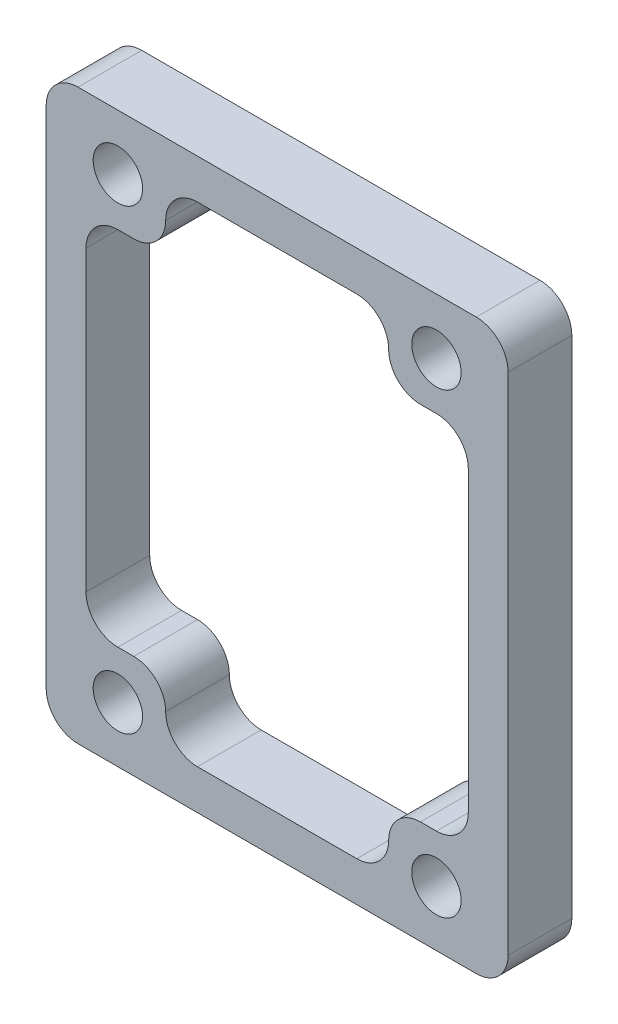
ISO-10303-21;
HEADER;
FILE_DESCRIPTION(('STEP AP214'),'2;1');
FILE_NAME('part.step','',(''),(''),'','','');
FILE_SCHEMA(('AUTOMOTIVE_DESIGN { 1 0 10303 214 1 1 1 1 }'));
ENDSEC;
DATA;
#1=APPLICATION_CONTEXT('core data for automotive mechanical design processes');
#2=APPLICATION_PROTOCOL_DEFINITION('international standard','automotive_design',2000,#1);
#3=PRODUCT_CONTEXT('',#1,'mechanical');
#4=PRODUCT('Part','Part','',(#3));
#5=PRODUCT_RELATED_PRODUCT_CATEGORY('part','',(#4));
#6=PRODUCT_DEFINITION_FORMATION('','',#4);
#7=PRODUCT_DEFINITION_CONTEXT('part definition',#1,'design');
#8=PRODUCT_DEFINITION('design','',#6,#7);
#9=PRODUCT_DEFINITION_SHAPE('','',#8);
#10=(LENGTH_UNIT() NAMED_UNIT(*) SI_UNIT(.MILLI.,.METRE.));
#11=(NAMED_UNIT(*) PLANE_ANGLE_UNIT() SI_UNIT($,.RADIAN.));
#12=(NAMED_UNIT(*) SI_UNIT($,.STERADIAN.) SOLID_ANGLE_UNIT());
#13=UNCERTAINTY_MEASURE_WITH_UNIT(LENGTH_MEASURE(1.E-05),#10,'distance_accuracy_value','');
#14=(GEOMETRIC_REPRESENTATION_CONTEXT(3) GLOBAL_UNCERTAINTY_ASSIGNED_CONTEXT((#13)) GLOBAL_UNIT_ASSIGNED_CONTEXT((#10,
#11,#12)) REPRESENTATION_CONTEXT('',''));
#15=CARTESIAN_POINT('',(0.,0.,0.));
#16=DIRECTION('',(0.,0.,1.));
#17=DIRECTION('',(1.,0.,0.));
#18=AXIS2_PLACEMENT_3D('',#15,#16,#17);
#19=CARTESIAN_POINT('',(12.,-11.35,8.));
#20=DIRECTION('',(0.,-1.,0.));
#21=DIRECTION('',(1.,0.,0.));
#22=AXIS2_PLACEMENT_3D('',#19,#20,#21);
#23=PLANE('',#22);
#24=DIRECTION('',(-1.,0.,0.));
#25=VECTOR('',#24,1.);
#26=CARTESIAN_POINT('',(12.,-11.35,-2.));
#27=LINE('',#26,#25);
#28=CARTESIAN_POINT('',(-9.,-11.35,-2.));
#29=VERTEX_POINT('',#28);
#30=CARTESIAN_POINT('',(-10.,-11.35,-2.));
#31=VERTEX_POINT('',#30);
#32=EDGE_CURVE('E456',#29,#31,#27,.T.);
#33=ORIENTED_EDGE('',*,*,#32,.T.);
#34=DIRECTION('',(0.,0.,-1.));
#35=VECTOR('',#34,1.);
#36=CARTESIAN_POINT('',(-10.,-11.35,2.));
#37=LINE('',#36,#35);
#38=CARTESIAN_POINT('',(-10.,-11.35,2.));
#39=VERTEX_POINT('',#38);
#40=EDGE_CURVE('E342',#31,#39,#37,.F.);
#41=ORIENTED_EDGE('',*,*,#40,.T.);
#42=DIRECTION('',(-1.,0.,0.));
#43=VECTOR('',#42,1.);
#44=CARTESIAN_POINT('',(0.,-11.35,2.));
#45=LINE('',#44,#43);
#46=CARTESIAN_POINT('',(-9.,-11.35,2.));
#47=VERTEX_POINT('',#46);
#48=EDGE_CURVE('E513',#47,#39,#45,.T.);
#49=ORIENTED_EDGE('',*,*,#48,.F.);
#50=DIRECTION('',(0.,0.,-1.));
#51=VECTOR('',#50,1.);
#52=CARTESIAN_POINT('',(-9.,-11.35,8.));
#53=LINE('',#52,#51);
#54=EDGE_CURVE('E339',#47,#29,#53,.T.);
#55=ORIENTED_EDGE('',*,*,#54,.T.);
#56=EDGE_LOOP('',(#33,#41,#49,#55));
#57=FACE_BOUND('',#56,.T.);
#58=ADVANCED_FACE('F39',(#57),#23,.F.);
#59=CARTESIAN_POINT('',(12.,11.35,8.));
#60=DIRECTION('',(0.,1.,0.));
#61=DIRECTION('',(-1.,0.,0.));
#62=AXIS2_PLACEMENT_3D('',#59,#60,#61);
#63=PLANE('',#62);
#64=DIRECTION('',(1.,0.,0.));
#65=VECTOR('',#64,1.);
#66=CARTESIAN_POINT('',(12.,11.35,-2.));
#67=LINE('',#66,#65);
#68=CARTESIAN_POINT('',(-10.,11.35,-2.));
#69=VERTEX_POINT('',#68);
#70=CARTESIAN_POINT('',(-9.,11.35,-2.));
#71=VERTEX_POINT('',#70);
#72=EDGE_CURVE('E445',#69,#71,#67,.T.);
#73=ORIENTED_EDGE('',*,*,#72,.T.);
#74=DIRECTION('',(0.,0.,1.));
#75=VECTOR('',#74,1.);
#76=CARTESIAN_POINT('',(-9.,11.35,8.));
#77=LINE('',#76,#75);
#78=CARTESIAN_POINT('',(-9.,11.35,2.));
#79=VERTEX_POINT('',#78);
#80=EDGE_CURVE('E332',#71,#79,#77,.T.);
#81=ORIENTED_EDGE('',*,*,#80,.T.);
#82=DIRECTION('',(1.,0.,0.));
#83=VECTOR('',#82,1.);
#84=CARTESIAN_POINT('',(0.,11.35,2.));
#85=LINE('',#84,#83);
#86=CARTESIAN_POINT('',(-10.,11.35,2.));
#87=VERTEX_POINT('',#86);
#88=EDGE_CURVE('E516',#87,#79,#85,.T.);
#89=ORIENTED_EDGE('',*,*,#88,.F.);
#90=DIRECTION('',(0.,0.,-1.));
#91=VECTOR('',#90,1.);
#92=CARTESIAN_POINT('',(-10.,11.35,-2.));
#93=LINE('',#92,#91);
#94=EDGE_CURVE('E329',#87,#69,#93,.T.);
#95=ORIENTED_EDGE('',*,*,#94,.T.);
#96=EDGE_LOOP('',(#73,#81,#89,#95));
#97=FACE_BOUND('',#96,.T.);
#98=ADVANCED_FACE('F574',(#97),#63,.F.);
#99=CARTESIAN_POINT('',(14.5,-17.85,2.));
#100=DIRECTION('',(-1.,0.,0.));
#101=DIRECTION('',(0.,0.,1.));
#102=AXIS2_PLACEMENT_3D('',#99,#100,#101);
#103=PLANE('',#102);
#104=DIRECTION('',(0.,1.,0.));
#105=VECTOR('',#104,1.);
#106=CARTESIAN_POINT('',(14.5,-17.85,2.));
#107=LINE('',#106,#105);
#108=CARTESIAN_POINT('',(14.5,-15.85,2.));
#109=VERTEX_POINT('',#108);
#110=CARTESIAN_POINT('',(14.5,15.85,2.));
#111=VERTEX_POINT('',#110);
#112=EDGE_CURVE('E247',#109,#111,#107,.T.);
#113=ORIENTED_EDGE('',*,*,#112,.F.);
#114=DIRECTION('',(0.,0.,-1.));
#115=VECTOR('',#114,1.);
#116=CARTESIAN_POINT('',(14.5,-15.85,2.));
#117=LINE('',#116,#115);
#118=CARTESIAN_POINT('',(14.5,-15.85,-2.));
#119=VERTEX_POINT('',#118);
#120=EDGE_CURVE('E231',#109,#119,#117,.T.);
#121=ORIENTED_EDGE('',*,*,#120,.T.);
#122=DIRECTION('',(0.,1.,0.));
#123=VECTOR('',#122,1.);
#124=CARTESIAN_POINT('',(14.5,-17.85,-2.));
#125=LINE('',#124,#123);
#126=CARTESIAN_POINT('',(14.5,15.85,-2.));
#127=VERTEX_POINT('',#126);
#128=EDGE_CURVE('E244',#119,#127,#125,.T.);
#129=ORIENTED_EDGE('',*,*,#128,.T.);
#130=DIRECTION('',(0.,0.,-1.));
#131=VECTOR('',#130,1.);
#132=CARTESIAN_POINT('',(14.5,15.85,2.));
#133=LINE('',#132,#131);
#134=EDGE_CURVE('E249',#127,#111,#133,.F.);
#135=ORIENTED_EDGE('',*,*,#134,.T.);
#136=EDGE_LOOP('',(#113,#121,#129,#135));
#137=FACE_BOUND('',#136,.T.);
#138=ADVANCED_FACE('F243',(#137),#103,.F.);
#139=CARTESIAN_POINT('',(-14.5,17.85,2.));
#140=DIRECTION('',(0.,-1.,0.));
#141=DIRECTION('',(0.,0.,-1.));
#142=AXIS2_PLACEMENT_3D('',#139,#140,#141);
#143=PLANE('',#142);
#144=DIRECTION('',(-1.,0.,0.));
#145=VECTOR('',#144,1.);
#146=CARTESIAN_POINT('',(-14.5,17.85,2.));
#147=LINE('',#146,#145);
#148=CARTESIAN_POINT('',(12.5,17.85,2.));
#149=VERTEX_POINT('',#148);
#150=CARTESIAN_POINT('',(-12.5,17.85,2.));
#151=VERTEX_POINT('',#150);
#152=EDGE_CURVE('E492',#149,#151,#147,.T.);
#153=ORIENTED_EDGE('',*,*,#152,.F.);
#154=DIRECTION('',(0.,0.,-1.));
#155=VECTOR('',#154,1.);
#156=CARTESIAN_POINT('',(12.5,17.85,2.));
#157=LINE('',#156,#155);
#158=CARTESIAN_POINT('',(12.5,17.85,-2.));
#159=VERTEX_POINT('',#158);
#160=EDGE_CURVE('E346',#149,#159,#157,.T.);
#161=ORIENTED_EDGE('',*,*,#160,.T.);
#162=DIRECTION('',(-1.,0.,0.));
#163=VECTOR('',#162,1.);
#164=CARTESIAN_POINT('',(-14.5,17.85,-2.));
#165=LINE('',#164,#163);
#166=CARTESIAN_POINT('',(-12.5,17.85,-2.));
#167=VERTEX_POINT('',#166);
#168=EDGE_CURVE('E254',#159,#167,#165,.T.);
#169=ORIENTED_EDGE('',*,*,#168,.T.);
#170=DIRECTION('',(0.,0.,-1.));
#171=VECTOR('',#170,1.);
#172=CARTESIAN_POINT('',(-12.5,17.85,2.));
#173=LINE('',#172,#171);
#174=EDGE_CURVE('E344',#167,#151,#173,.F.);
#175=ORIENTED_EDGE('',*,*,#174,.T.);
#176=EDGE_LOOP('',(#153,#161,#169,#175));
#177=FACE_BOUND('',#176,.T.);
#178=ADVANCED_FACE('F621',(#177),#143,.F.);
#179=CARTESIAN_POINT('',(-14.5,-17.85,2.));
#180=DIRECTION('',(1.,0.,0.));
#181=DIRECTION('',(0.,0.,-1.));
#182=AXIS2_PLACEMENT_3D('',#179,#180,#181);
#183=PLANE('',#182);
#184=DIRECTION('',(0.,-1.,0.));
#185=VECTOR('',#184,1.);
#186=CARTESIAN_POINT('',(-14.5,-17.85,-2.));
#187=LINE('',#186,#185);
#188=CARTESIAN_POINT('',(-14.5,15.85,-2.));
#189=VERTEX_POINT('',#188);
#190=CARTESIAN_POINT('',(-14.5,-15.85,-2.));
#191=VERTEX_POINT('',#190);
#192=EDGE_CURVE('E258',#189,#191,#187,.T.);
#193=ORIENTED_EDGE('',*,*,#192,.T.);
#194=DIRECTION('',(0.,0.,-1.));
#195=VECTOR('',#194,1.);
#196=CARTESIAN_POINT('',(-14.5,-15.85,2.));
#197=LINE('',#196,#195);
#198=CARTESIAN_POINT('',(-14.5,-15.85,2.));
#199=VERTEX_POINT('',#198);
#200=EDGE_CURVE('E56',#191,#199,#197,.F.);
#201=ORIENTED_EDGE('',*,*,#200,.T.);
#202=DIRECTION('',(0.,-1.,0.));
#203=VECTOR('',#202,1.);
#204=CARTESIAN_POINT('',(-14.5,-17.85,2.));
#205=LINE('',#204,#203);
#206=CARTESIAN_POINT('',(-14.5,15.85,2.));
#207=VERTEX_POINT('',#206);
#208=EDGE_CURVE('E490',#207,#199,#205,.T.);
#209=ORIENTED_EDGE('',*,*,#208,.F.);
#210=DIRECTION('',(0.,0.,-1.));
#211=VECTOR('',#210,1.);
#212=CARTESIAN_POINT('',(-14.5,15.85,2.));
#213=LINE('',#212,#211);
#214=EDGE_CURVE('E300',#207,#189,#213,.T.);
#215=ORIENTED_EDGE('',*,*,#214,.T.);
#216=EDGE_LOOP('',(#193,#201,#209,#215));
#217=FACE_BOUND('',#216,.T.);
#218=ADVANCED_FACE('F617',(#217),#183,.F.);
#219=CARTESIAN_POINT('',(-14.5,-17.85,2.));
#220=DIRECTION('',(0.,1.,0.));
#221=DIRECTION('',(0.,0.,1.));
#222=AXIS2_PLACEMENT_3D('',#219,#220,#221);
#223=PLANE('',#222);
#224=DIRECTION('',(1.,0.,0.));
#225=VECTOR('',#224,1.);
#226=CARTESIAN_POINT('',(-14.5,-17.85,-2.));
#227=LINE('',#226,#225);
#228=CARTESIAN_POINT('',(-12.5,-17.85,-2.));
#229=VERTEX_POINT('',#228);
#230=CARTESIAN_POINT('',(12.5,-17.85,-2.));
#231=VERTEX_POINT('',#230);
#232=EDGE_CURVE('E475',#229,#231,#227,.T.);
#233=ORIENTED_EDGE('',*,*,#232,.T.);
#234=DIRECTION('',(0.,0.,-1.));
#235=VECTOR('',#234,1.);
#236=CARTESIAN_POINT('',(12.5,-17.85,2.));
#237=LINE('',#236,#235);
#238=CARTESIAN_POINT('',(12.5,-17.85,2.));
#239=VERTEX_POINT('',#238);
#240=EDGE_CURVE('E232',#231,#239,#237,.F.);
#241=ORIENTED_EDGE('',*,*,#240,.T.);
#242=DIRECTION('',(1.,0.,0.));
#243=VECTOR('',#242,1.);
#244=CARTESIAN_POINT('',(-14.5,-17.85,2.));
#245=LINE('',#244,#243);
#246=CARTESIAN_POINT('',(-12.5,-17.85,2.));
#247=VERTEX_POINT('',#246);
#248=EDGE_CURVE('E265',#247,#239,#245,.T.);
#249=ORIENTED_EDGE('',*,*,#248,.F.);
#250=DIRECTION('',(0.,0.,-1.));
#251=VECTOR('',#250,1.);
#252=CARTESIAN_POINT('',(-12.5,-17.85,2.));
#253=LINE('',#252,#251);
#254=EDGE_CURVE('E237',#247,#229,#253,.T.);
#255=ORIENTED_EDGE('',*,*,#254,.T.);
#256=EDGE_LOOP('',(#233,#241,#249,#255));
#257=FACE_BOUND('',#256,.T.);
#258=ADVANCED_FACE('F612',(#257),#223,.F.);
#259=CARTESIAN_POINT('',(0.,0.,2.));
#260=DIRECTION('',(0.,0.,-1.));
#261=DIRECTION('',(-1.,0.,0.));
#262=AXIS2_PLACEMENT_3D('',#259,#260,#261);
#263=PLANE('',#262);
#264=CARTESIAN_POINT('',(9.99999999999999,-11.35,2.));
#265=VERTEX_POINT('',#264);
#266=CARTESIAN_POINT('',(8.99999999999999,-11.35,2.));
#267=VERTEX_POINT('',#266);
#268=EDGE_CURVE('E511',#265,#267,#45,.T.);
#269=ORIENTED_EDGE('',*,*,#268,.T.);
#270=CARTESIAN_POINT('',(8.99999999999999,-13.35,2.));
#271=DIRECTION('',(0.,0.,-1.));
#272=DIRECTION('',(-1.,0.,0.));
#273=AXIS2_PLACEMENT_3D('',#270,#271,#272);
#274=CIRCLE('',#273,2.);
#275=CARTESIAN_POINT('',(6.99999999999999,-13.35,2.));
#276=VERTEX_POINT('',#275);
#277=EDGE_CURVE('E294',#267,#276,#274,.F.);
#278=ORIENTED_EDGE('',*,*,#277,.T.);
#279=CARTESIAN_POINT('',(4.99999999999999,-13.35,2.));
#280=DIRECTION('',(0.,0.,-1.));
#281=DIRECTION('',(-1.,0.,0.));
#282=AXIS2_PLACEMENT_3D('',#279,#280,#281);
#283=CIRCLE('',#282,2.);
#284=CARTESIAN_POINT('',(4.99999999999999,-15.35,2.));
#285=VERTEX_POINT('',#284);
#286=EDGE_CURVE('E351',#276,#285,#283,.T.);
#287=ORIENTED_EDGE('',*,*,#286,.T.);
#288=DIRECTION('',(-1.,0.,0.));
#289=VECTOR('',#288,1.);
#290=CARTESIAN_POINT('',(0.,-15.35,2.));
#291=LINE('',#290,#289);
#292=CARTESIAN_POINT('',(-5.,-15.35,2.));
#293=VERTEX_POINT('',#292);
#294=EDGE_CURVE('E415',#285,#293,#291,.T.);
#295=ORIENTED_EDGE('',*,*,#294,.T.);
#296=CARTESIAN_POINT('',(-5.,-13.35,2.));
#297=DIRECTION('',(0.,0.,-1.));
#298=DIRECTION('',(-1.,0.,0.));
#299=AXIS2_PLACEMENT_3D('',#296,#297,#298);
#300=CIRCLE('',#299,2.);
#301=CARTESIAN_POINT('',(-7.,-13.35,2.));
#302=VERTEX_POINT('',#301);
#303=EDGE_CURVE('E12',#293,#302,#300,.T.);
#304=ORIENTED_EDGE('',*,*,#303,.T.);
#305=CARTESIAN_POINT('',(-9.,-13.35,2.));
#306=DIRECTION('',(0.,0.,-1.));
#307=DIRECTION('',(-1.,0.,0.));
#308=AXIS2_PLACEMENT_3D('',#305,#306,#307);
#309=CIRCLE('',#308,2.);
#310=EDGE_CURVE('E288',#302,#47,#309,.F.);
#311=ORIENTED_EDGE('',*,*,#310,.T.);
#312=ORIENTED_EDGE('',*,*,#48,.T.);
#313=CARTESIAN_POINT('',(-10.,-9.35,2.));
#314=DIRECTION('',(0.,0.,-1.));
#315=DIRECTION('',(-1.,0.,0.));
#316=AXIS2_PLACEMENT_3D('',#313,#314,#315);
#317=CIRCLE('',#316,2.);
#318=CARTESIAN_POINT('',(-12.,-9.35,2.));
#319=VERTEX_POINT('',#318);
#320=EDGE_CURVE('E375',#39,#319,#317,.T.);
#321=ORIENTED_EDGE('',*,*,#320,.T.);
#322=DIRECTION('',(0.,1.,0.));
#323=VECTOR('',#322,1.);
#324=CARTESIAN_POINT('',(-12.,0.,2.));
#325=LINE('',#324,#323);
#326=CARTESIAN_POINT('',(-12.,9.35,2.));
#327=VERTEX_POINT('',#326);
#328=EDGE_CURVE('E504',#319,#327,#325,.T.);
#329=ORIENTED_EDGE('',*,*,#328,.T.);
#330=CARTESIAN_POINT('',(-10.,9.35,2.));
#331=DIRECTION('',(0.,0.,-1.));
#332=DIRECTION('',(-1.,0.,0.));
#333=AXIS2_PLACEMENT_3D('',#330,#331,#332);
#334=CIRCLE('',#333,2.);
#335=EDGE_CURVE('E371',#327,#87,#334,.T.);
#336=ORIENTED_EDGE('',*,*,#335,.T.);
#337=ORIENTED_EDGE('',*,*,#88,.T.);
#338=CARTESIAN_POINT('',(-9.,13.35,2.));
#339=DIRECTION('',(0.,0.,-1.));
#340=DIRECTION('',(-1.,0.,0.));
#341=AXIS2_PLACEMENT_3D('',#338,#339,#340);
#342=CIRCLE('',#341,2.);
#343=CARTESIAN_POINT('',(-7.,13.35,2.));
#344=VERTEX_POINT('',#343);
#345=EDGE_CURVE('E290',#79,#344,#342,.F.);
#346=ORIENTED_EDGE('',*,*,#345,.T.);
#347=CARTESIAN_POINT('',(-5.,13.35,2.));
#348=DIRECTION('',(0.,0.,-1.));
#349=DIRECTION('',(-1.,0.,0.));
#350=AXIS2_PLACEMENT_3D('',#347,#348,#349);
#351=CIRCLE('',#350,2.);
#352=CARTESIAN_POINT('',(-5.,15.35,2.));
#353=VERTEX_POINT('',#352);
#354=EDGE_CURVE('E367',#344,#353,#351,.T.);
#355=ORIENTED_EDGE('',*,*,#354,.T.);
#356=DIRECTION('',(1.,0.,0.));
#357=VECTOR('',#356,1.);
#358=CARTESIAN_POINT('',(0.,15.35,2.));
#359=LINE('',#358,#357);
#360=CARTESIAN_POINT('',(5.,15.35,2.));
#361=VERTEX_POINT('',#360);
#362=EDGE_CURVE('E412',#353,#361,#359,.T.);
#363=ORIENTED_EDGE('',*,*,#362,.T.);
#364=CARTESIAN_POINT('',(5.,13.35,2.));
#365=DIRECTION('',(0.,0.,-1.));
#366=DIRECTION('',(-1.,0.,0.));
#367=AXIS2_PLACEMENT_3D('',#364,#365,#366);
#368=CIRCLE('',#367,2.);
#369=CARTESIAN_POINT('',(7.,13.35,2.));
#370=VERTEX_POINT('',#369);
#371=EDGE_CURVE('E363',#361,#370,#368,.T.);
#372=ORIENTED_EDGE('',*,*,#371,.T.);
#373=CARTESIAN_POINT('',(9.,13.35,2.));
#374=DIRECTION('',(0.,0.,-1.));
#375=DIRECTION('',(-1.,0.,0.));
#376=AXIS2_PLACEMENT_3D('',#373,#374,#375);
#377=CIRCLE('',#376,2.);
#378=CARTESIAN_POINT('',(9.,11.35,2.));
#379=VERTEX_POINT('',#378);
#380=EDGE_CURVE('E292',#370,#379,#377,.F.);
#381=ORIENTED_EDGE('',*,*,#380,.T.);
#382=CARTESIAN_POINT('',(10.,11.35,2.));
#383=VERTEX_POINT('',#382);
#384=EDGE_CURVE('E461',#379,#383,#85,.T.);
#385=ORIENTED_EDGE('',*,*,#384,.T.);
#386=CARTESIAN_POINT('',(10.,9.35,2.));
#387=DIRECTION('',(0.,0.,-1.));
#388=DIRECTION('',(-1.,0.,0.));
#389=AXIS2_PLACEMENT_3D('',#386,#387,#388);
#390=CIRCLE('',#389,2.);
#391=CARTESIAN_POINT('',(12.,9.35,2.));
#392=VERTEX_POINT('',#391);
#393=EDGE_CURVE('E359',#383,#392,#390,.T.);
#394=ORIENTED_EDGE('',*,*,#393,.T.);
#395=DIRECTION('',(0.,-1.,0.));
#396=VECTOR('',#395,1.);
#397=CARTESIAN_POINT('',(12.,0.,2.));
#398=LINE('',#397,#396);
#399=CARTESIAN_POINT('',(12.,-9.35,2.));
#400=VERTEX_POINT('',#399);
#401=EDGE_CURVE('E514',#392,#400,#398,.T.);
#402=ORIENTED_EDGE('',*,*,#401,.T.);
#403=CARTESIAN_POINT('',(9.99999999999999,-9.35,2.));
#404=DIRECTION('',(0.,0.,-1.));
#405=DIRECTION('',(-1.,0.,0.));
#406=AXIS2_PLACEMENT_3D('',#403,#404,#405);
#407=CIRCLE('',#406,2.);
#408=EDGE_CURVE('E355',#400,#265,#407,.T.);
#409=ORIENTED_EDGE('',*,*,#408,.T.);
#410=EDGE_LOOP('',(#269,#278,#287,#295,#304,#311,#312,#321,#329,#336,#337,#346,#355,#363,#372,
#381,#385,#394,#402,#409));
#411=FACE_BOUND('',#410,.T.);
#412=CARTESIAN_POINT('',(-10.,14.35,2.));
#413=DIRECTION('',(0.,0.,1.));
#414=DIRECTION('',(1.,0.,0.));
#415=AXIS2_PLACEMENT_3D('',#412,#413,#414);
#416=CIRCLE('',#415,1.55);
#417=CARTESIAN_POINT('',(-8.45,14.35,2.));
#418=VERTEX_POINT('',#417);
#419=EDGE_CURVE('E500',#418,#418,#416,.T.);
#420=ORIENTED_EDGE('',*,*,#419,.F.);
#421=EDGE_LOOP('',(#420));
#422=FACE_BOUND('',#421,.T.);
#423=CARTESIAN_POINT('',(-10.,-14.35,2.));
#424=DIRECTION('',(0.,0.,1.));
#425=DIRECTION('',(1.,0.,0.));
#426=AXIS2_PLACEMENT_3D('',#423,#424,#425);
#427=CIRCLE('',#426,1.55);
#428=CARTESIAN_POINT('',(-8.45,-14.35,2.));
#429=VERTEX_POINT('',#428);
#430=EDGE_CURVE('E503',#429,#429,#427,.T.);
#431=ORIENTED_EDGE('',*,*,#430,.F.);
#432=EDGE_LOOP('',(#431));
#433=FACE_BOUND('',#432,.T.);
#434=CARTESIAN_POINT('',(10.,-14.35,2.));
#435=DIRECTION('',(0.,0.,1.));
#436=DIRECTION('',(1.,0.,0.));
#437=AXIS2_PLACEMENT_3D('',#434,#435,#436);
#438=CIRCLE('',#437,1.55);
#439=CARTESIAN_POINT('',(11.55,-14.35,2.));
#440=VERTEX_POINT('',#439);
#441=EDGE_CURVE('E499',#440,#440,#438,.T.);
#442=ORIENTED_EDGE('',*,*,#441,.F.);
#443=EDGE_LOOP('',(#442));
#444=FACE_BOUND('',#443,.T.);
#445=CARTESIAN_POINT('',(10.,14.35,2.));
#446=DIRECTION('',(0.,0.,1.));
#447=DIRECTION('',(1.,0.,0.));
#448=AXIS2_PLACEMENT_3D('',#445,#446,#447);
#449=CIRCLE('',#448,1.55);
#450=CARTESIAN_POINT('',(11.55,14.35,2.));
#451=VERTEX_POINT('',#450);
#452=EDGE_CURVE('E482',#451,#451,#449,.T.);
#453=ORIENTED_EDGE('',*,*,#452,.F.);
#454=EDGE_LOOP('',(#453));
#455=FACE_BOUND('',#454,.T.);
#456=ORIENTED_EDGE('',*,*,#248,.T.);
#457=CARTESIAN_POINT('',(12.5,-15.85,2.));
#458=DIRECTION('',(0.,0.,-1.));
#459=DIRECTION('',(-1.,0.,0.));
#460=AXIS2_PLACEMENT_3D('',#457,#458,#459);
#461=CIRCLE('',#460,2.);
#462=EDGE_CURVE('E298',#239,#109,#461,.F.);
#463=ORIENTED_EDGE('',*,*,#462,.T.);
#464=ORIENTED_EDGE('',*,*,#112,.T.);
#465=CARTESIAN_POINT('',(12.5,15.85,2.));
#466=DIRECTION('',(0.,0.,-1.));
#467=DIRECTION('',(-1.,0.,0.));
#468=AXIS2_PLACEMENT_3D('',#465,#466,#467);
#469=CIRCLE('',#468,2.);
#470=EDGE_CURVE('E286',#111,#149,#469,.F.);
#471=ORIENTED_EDGE('',*,*,#470,.T.);
#472=ORIENTED_EDGE('',*,*,#152,.T.);
#473=CARTESIAN_POINT('',(-12.5,15.85,2.));
#474=DIRECTION('',(0.,0.,-1.));
#475=DIRECTION('',(-1.,0.,0.));
#476=AXIS2_PLACEMENT_3D('',#473,#474,#475);
#477=CIRCLE('',#476,2.);
#478=EDGE_CURVE('E63',#151,#207,#477,.F.);
#479=ORIENTED_EDGE('',*,*,#478,.T.);
#480=ORIENTED_EDGE('',*,*,#208,.T.);
#481=CARTESIAN_POINT('',(-12.5,-15.85,2.));
#482=DIRECTION('',(0.,0.,-1.));
#483=DIRECTION('',(-1.,0.,0.));
#484=AXIS2_PLACEMENT_3D('',#481,#482,#483);
#485=CIRCLE('',#484,2.);
#486=EDGE_CURVE('E296',#199,#247,#485,.F.);
#487=ORIENTED_EDGE('',*,*,#486,.T.);
#488=EDGE_LOOP('',(#456,#463,#464,#471,#472,#479,#480,#487));
#489=FACE_BOUND('',#488,.T.);
#490=ADVANCED_FACE('F540',(#411,#422,#433,#444,#455,#489),#263,.F.);
#491=CARTESIAN_POINT('',(0.,0.,-2.));
#492=DIRECTION('',(0.,0.,-1.));
#493=DIRECTION('',(-1.,0.,0.));
#494=AXIS2_PLACEMENT_3D('',#491,#492,#493);
#495=PLANE('',#494);
#496=DIRECTION('',(-1.,0.,0.));
#497=VECTOR('',#496,1.);
#498=CARTESIAN_POINT('',(6.99999999999999,-15.35,-2.));
#499=LINE('',#498,#497);
#500=CARTESIAN_POINT('',(4.99999999999999,-15.35,-2.));
#501=VERTEX_POINT('',#500);
#502=CARTESIAN_POINT('',(-5.,-15.35,-2.));
#503=VERTEX_POINT('',#502);
#504=EDGE_CURVE('E405',#501,#503,#499,.T.);
#505=ORIENTED_EDGE('',*,*,#504,.F.);
#506=CARTESIAN_POINT('',(4.99999999999999,-13.35,-2.));
#507=DIRECTION('',(0.,0.,-1.));
#508=DIRECTION('',(-1.,0.,0.));
#509=AXIS2_PLACEMENT_3D('',#506,#507,#508);
#510=CIRCLE('',#509,2.);
#511=CARTESIAN_POINT('',(6.99999999999999,-13.35,-2.));
#512=VERTEX_POINT('',#511);
#513=EDGE_CURVE('E349',#501,#512,#510,.F.);
#514=ORIENTED_EDGE('',*,*,#513,.T.);
#515=CARTESIAN_POINT('',(8.99999999999999,-13.35,-2.));
#516=DIRECTION('',(0.,0.,-1.));
#517=DIRECTION('',(-1.,0.,0.));
#518=AXIS2_PLACEMENT_3D('',#515,#516,#517);
#519=CIRCLE('',#518,2.);
#520=CARTESIAN_POINT('',(8.99999999999999,-11.35,-2.));
#521=VERTEX_POINT('',#520);
#522=EDGE_CURVE('E427',#512,#521,#519,.T.);
#523=ORIENTED_EDGE('',*,*,#522,.T.);
#524=CARTESIAN_POINT('',(9.99999999999999,-11.35,-2.));
#525=VERTEX_POINT('',#524);
#526=EDGE_CURVE('E460',#525,#521,#27,.T.);
#527=ORIENTED_EDGE('',*,*,#526,.F.);
#528=CARTESIAN_POINT('',(9.99999999999999,-9.35,-2.));
#529=DIRECTION('',(0.,0.,-1.));
#530=DIRECTION('',(-1.,0.,0.));
#531=AXIS2_PLACEMENT_3D('',#528,#529,#530);
#532=CIRCLE('',#531,2.);
#533=CARTESIAN_POINT('',(12.,-9.35,-2.));
#534=VERTEX_POINT('',#533);
#535=EDGE_CURVE('E353',#525,#534,#532,.F.);
#536=ORIENTED_EDGE('',*,*,#535,.T.);
#537=DIRECTION('',(0.,-1.,0.));
#538=VECTOR('',#537,1.);
#539=CARTESIAN_POINT('',(12.,-11.35,-2.));
#540=LINE('',#539,#538);
#541=CARTESIAN_POINT('',(12.,9.35,-2.));
#542=VERTEX_POINT('',#541);
#543=EDGE_CURVE('E449',#542,#534,#540,.T.);
#544=ORIENTED_EDGE('',*,*,#543,.F.);
#545=CARTESIAN_POINT('',(10.,9.35,-2.));
#546=DIRECTION('',(0.,0.,-1.));
#547=DIRECTION('',(-1.,0.,0.));
#548=AXIS2_PLACEMENT_3D('',#545,#546,#547);
#549=CIRCLE('',#548,2.);
#550=CARTESIAN_POINT('',(10.,11.35,-2.));
#551=VERTEX_POINT('',#550);
#552=EDGE_CURVE('E357',#542,#551,#549,.F.);
#553=ORIENTED_EDGE('',*,*,#552,.T.);
#554=CARTESIAN_POINT('',(9.,11.35,-2.));
#555=VERTEX_POINT('',#554);
#556=EDGE_CURVE('E450',#555,#551,#67,.T.);
#557=ORIENTED_EDGE('',*,*,#556,.F.);
#558=CARTESIAN_POINT('',(9.,13.35,-2.));
#559=DIRECTION('',(0.,0.,-1.));
#560=DIRECTION('',(-1.,0.,0.));
#561=AXIS2_PLACEMENT_3D('',#558,#559,#560);
#562=CIRCLE('',#561,2.);
#563=CARTESIAN_POINT('',(7.,13.35,-2.));
#564=VERTEX_POINT('',#563);
#565=EDGE_CURVE('E430',#555,#564,#562,.T.);
#566=ORIENTED_EDGE('',*,*,#565,.T.);
#567=CARTESIAN_POINT('',(5.,13.35,-2.));
#568=DIRECTION('',(0.,0.,-1.));
#569=DIRECTION('',(-1.,0.,0.));
#570=AXIS2_PLACEMENT_3D('',#567,#568,#569);
#571=CIRCLE('',#570,2.);
#572=CARTESIAN_POINT('',(5.,15.35,-2.));
#573=VERTEX_POINT('',#572);
#574=EDGE_CURVE('E361',#564,#573,#571,.F.);
#575=ORIENTED_EDGE('',*,*,#574,.T.);
#576=DIRECTION('',(1.,0.,0.));
#577=VECTOR('',#576,1.);
#578=CARTESIAN_POINT('',(7.,15.35,-2.));
#579=LINE('',#578,#577);
#580=CARTESIAN_POINT('',(-5.,15.35,-2.));
#581=VERTEX_POINT('',#580);
#582=EDGE_CURVE('E381',#581,#573,#579,.T.);
#583=ORIENTED_EDGE('',*,*,#582,.F.);
#584=CARTESIAN_POINT('',(-5.,13.35,-2.));
#585=DIRECTION('',(0.,0.,-1.));
#586=DIRECTION('',(-1.,0.,0.));
#587=AXIS2_PLACEMENT_3D('',#584,#585,#586);
#588=CIRCLE('',#587,2.);
#589=CARTESIAN_POINT('',(-7.,13.35,-2.));
#590=VERTEX_POINT('',#589);
#591=EDGE_CURVE('E365',#581,#590,#588,.F.);
#592=ORIENTED_EDGE('',*,*,#591,.T.);
#593=CARTESIAN_POINT('',(-9.,13.35,-2.));
#594=DIRECTION('',(0.,0.,-1.));
#595=DIRECTION('',(-1.,0.,0.));
#596=AXIS2_PLACEMENT_3D('',#593,#594,#595);
#597=CIRCLE('',#596,2.);
#598=EDGE_CURVE('E433',#590,#71,#597,.T.);
#599=ORIENTED_EDGE('',*,*,#598,.T.);
#600=ORIENTED_EDGE('',*,*,#72,.F.);
#601=CARTESIAN_POINT('',(-10.,9.35,-2.));
#602=DIRECTION('',(0.,0.,-1.));
#603=DIRECTION('',(-1.,0.,0.));
#604=AXIS2_PLACEMENT_3D('',#601,#602,#603);
#605=CIRCLE('',#604,2.);
#606=CARTESIAN_POINT('',(-12.,9.35,-2.));
#607=VERTEX_POINT('',#606);
#608=EDGE_CURVE('E369',#69,#607,#605,.F.);
#609=ORIENTED_EDGE('',*,*,#608,.T.);
#610=DIRECTION('',(0.,1.,0.));
#611=VECTOR('',#610,1.);
#612=CARTESIAN_POINT('',(-12.,-11.35,-2.));
#613=LINE('',#612,#611);
#614=CARTESIAN_POINT('',(-12.,-9.35,-2.));
#615=VERTEX_POINT('',#614);
#616=EDGE_CURVE('E451',#615,#607,#613,.T.);
#617=ORIENTED_EDGE('',*,*,#616,.F.);
#618=CARTESIAN_POINT('',(-10.,-9.35,-2.));
#619=DIRECTION('',(0.,0.,-1.));
#620=DIRECTION('',(-1.,0.,0.));
#621=AXIS2_PLACEMENT_3D('',#618,#619,#620);
#622=CIRCLE('',#621,2.);
#623=EDGE_CURVE('E373',#615,#31,#622,.F.);
#624=ORIENTED_EDGE('',*,*,#623,.T.);
#625=ORIENTED_EDGE('',*,*,#32,.F.);
#626=CARTESIAN_POINT('',(-9.,-13.35,-2.));
#627=DIRECTION('',(0.,0.,-1.));
#628=DIRECTION('',(-1.,0.,0.));
#629=AXIS2_PLACEMENT_3D('',#626,#627,#628);
#630=CIRCLE('',#629,2.);
#631=CARTESIAN_POINT('',(-7.,-13.35,-2.));
#632=VERTEX_POINT('',#631);
#633=EDGE_CURVE('E395',#29,#632,#630,.T.);
#634=ORIENTED_EDGE('',*,*,#633,.T.);
#635=CARTESIAN_POINT('',(-5.,-13.35,-2.));
#636=DIRECTION('',(0.,0.,-1.));
#637=DIRECTION('',(-1.,0.,0.));
#638=AXIS2_PLACEMENT_3D('',#635,#636,#637);
#639=CIRCLE('',#638,2.);
#640=EDGE_CURVE('E48',#632,#503,#639,.F.);
#641=ORIENTED_EDGE('',*,*,#640,.T.);
#642=EDGE_LOOP('',(#505,#514,#523,#527,#536,#544,#553,#557,#566,#575,#583,#592,#599,#600,#609,
#617,#624,#625,#634,#641));
#643=FACE_BOUND('',#642,.T.);
#644=CARTESIAN_POINT('',(-10.,14.35,-2.));
#645=DIRECTION('',(0.,0.,-1.));
#646=DIRECTION('',(-1.,0.,0.));
#647=AXIS2_PLACEMENT_3D('',#644,#645,#646);
#648=CIRCLE('',#647,1.55);
#649=CARTESIAN_POINT('',(-11.55,14.35,-2.));
#650=VERTEX_POINT('',#649);
#651=EDGE_CURVE('E255',#650,#650,#648,.T.);
#652=ORIENTED_EDGE('',*,*,#651,.F.);
#653=EDGE_LOOP('',(#652));
#654=FACE_BOUND('',#653,.T.);
#655=CARTESIAN_POINT('',(-10.,-14.35,-2.));
#656=DIRECTION('',(0.,0.,-1.));
#657=DIRECTION('',(-1.,0.,0.));
#658=AXIS2_PLACEMENT_3D('',#655,#656,#657);
#659=CIRCLE('',#658,1.55);
#660=CARTESIAN_POINT('',(-11.55,-14.35,-2.));
#661=VERTEX_POINT('',#660);
#662=EDGE_CURVE('E261',#661,#661,#659,.T.);
#663=ORIENTED_EDGE('',*,*,#662,.F.);
#664=EDGE_LOOP('',(#663));
#665=FACE_BOUND('',#664,.T.);
#666=CARTESIAN_POINT('',(10.,-14.35,-2.));
#667=DIRECTION('',(0.,0.,-1.));
#668=DIRECTION('',(-1.,0.,0.));
#669=AXIS2_PLACEMENT_3D('',#666,#667,#668);
#670=CIRCLE('',#669,1.55);
#671=CARTESIAN_POINT('',(8.45,-14.35,-2.));
#672=VERTEX_POINT('',#671);
#673=EDGE_CURVE('E481',#672,#672,#670,.T.);
#674=ORIENTED_EDGE('',*,*,#673,.F.);
#675=EDGE_LOOP('',(#674));
#676=FACE_BOUND('',#675,.T.);
#677=CARTESIAN_POINT('',(10.,14.35,-2.));
#678=DIRECTION('',(0.,0.,-1.));
#679=DIRECTION('',(-1.,0.,0.));
#680=AXIS2_PLACEMENT_3D('',#677,#678,#679);
#681=CIRCLE('',#680,1.55);
#682=CARTESIAN_POINT('',(8.45,14.35,-2.));
#683=VERTEX_POINT('',#682);
#684=EDGE_CURVE('E477',#683,#683,#681,.T.);
#685=ORIENTED_EDGE('',*,*,#684,.F.);
#686=EDGE_LOOP('',(#685));
#687=FACE_BOUND('',#686,.T.);
#688=ORIENTED_EDGE('',*,*,#128,.F.);
#689=CARTESIAN_POINT('',(12.5,-15.85,-2.));
#690=DIRECTION('',(0.,0.,-1.));
#691=DIRECTION('',(-1.,0.,0.));
#692=AXIS2_PLACEMENT_3D('',#689,#690,#691);
#693=CIRCLE('',#692,2.);
#694=EDGE_CURVE('E227',#119,#231,#693,.T.);
#695=ORIENTED_EDGE('',*,*,#694,.T.);
#696=ORIENTED_EDGE('',*,*,#232,.F.);
#697=CARTESIAN_POINT('',(-12.5,-15.85,-2.));
#698=DIRECTION('',(0.,0.,-1.));
#699=DIRECTION('',(-1.,0.,0.));
#700=AXIS2_PLACEMENT_3D('',#697,#698,#699);
#701=CIRCLE('',#700,2.);
#702=EDGE_CURVE('E238',#229,#191,#701,.T.);
#703=ORIENTED_EDGE('',*,*,#702,.T.);
#704=ORIENTED_EDGE('',*,*,#192,.F.);
#705=CARTESIAN_POINT('',(-12.5,15.85,-2.));
#706=DIRECTION('',(0.,0.,-1.));
#707=DIRECTION('',(-1.,0.,0.));
#708=AXIS2_PLACEMENT_3D('',#705,#706,#707);
#709=CIRCLE('',#708,2.);
#710=EDGE_CURVE('E248',#189,#167,#709,.T.);
#711=ORIENTED_EDGE('',*,*,#710,.T.);
#712=ORIENTED_EDGE('',*,*,#168,.F.);
#713=CARTESIAN_POINT('',(12.5,15.85,-2.));
#714=DIRECTION('',(0.,0.,-1.));
#715=DIRECTION('',(-1.,0.,0.));
#716=AXIS2_PLACEMENT_3D('',#713,#714,#715);
#717=CIRCLE('',#716,2.);
#718=EDGE_CURVE('E253',#159,#127,#717,.T.);
#719=ORIENTED_EDGE('',*,*,#718,.T.);
#720=EDGE_LOOP('',(#688,#695,#696,#703,#704,#711,#712,#719));
#721=FACE_BOUND('',#720,.T.);
#722=ADVANCED_FACE('F251',(#643,#654,#665,#676,#687,#721),#495,.T.);
#723=CARTESIAN_POINT('',(10.,14.35,-22.));
#724=DIRECTION('',(0.,0.,1.));
#725=DIRECTION('',(1.,0.,0.));
#726=AXIS2_PLACEMENT_3D('',#723,#724,#725);
#727=CYLINDRICAL_SURFACE('',#726,1.55);
#728=ORIENTED_EDGE('',*,*,#684,.T.);
#729=EDGE_LOOP('',(#728));
#730=FACE_BOUND('',#729,.T.);
#731=ORIENTED_EDGE('',*,*,#452,.T.);
#732=EDGE_LOOP('',(#731));
#733=FACE_BOUND('',#732,.T.);
#734=ADVANCED_FACE('F602',(#730,#733),#727,.F.);
#735=CARTESIAN_POINT('',(10.,-14.35,-22.));
#736=DIRECTION('',(0.,0.,1.));
#737=DIRECTION('',(1.,0.,0.));
#738=AXIS2_PLACEMENT_3D('',#735,#736,#737);
#739=CYLINDRICAL_SURFACE('',#738,1.55);
#740=ORIENTED_EDGE('',*,*,#673,.T.);
#741=EDGE_LOOP('',(#740));
#742=FACE_BOUND('',#741,.T.);
#743=ORIENTED_EDGE('',*,*,#441,.T.);
#744=EDGE_LOOP('',(#743));
#745=FACE_BOUND('',#744,.T.);
#746=ADVANCED_FACE('F599',(#742,#745),#739,.F.);
#747=CARTESIAN_POINT('',(-10.,-14.35,-22.));
#748=DIRECTION('',(0.,0.,1.));
#749=DIRECTION('',(1.,0.,0.));
#750=AXIS2_PLACEMENT_3D('',#747,#748,#749);
#751=CYLINDRICAL_SURFACE('',#750,1.55);
#752=ORIENTED_EDGE('',*,*,#662,.T.);
#753=EDGE_LOOP('',(#752));
#754=FACE_BOUND('',#753,.T.);
#755=ORIENTED_EDGE('',*,*,#430,.T.);
#756=EDGE_LOOP('',(#755));
#757=FACE_BOUND('',#756,.T.);
#758=ADVANCED_FACE('F595',(#754,#757),#751,.F.);
#759=CARTESIAN_POINT('',(-10.,14.35,-22.));
#760=DIRECTION('',(0.,0.,1.));
#761=DIRECTION('',(1.,0.,0.));
#762=AXIS2_PLACEMENT_3D('',#759,#760,#761);
#763=CYLINDRICAL_SURFACE('',#762,1.55);
#764=ORIENTED_EDGE('',*,*,#651,.T.);
#765=EDGE_LOOP('',(#764));
#766=FACE_BOUND('',#765,.T.);
#767=ORIENTED_EDGE('',*,*,#419,.T.);
#768=EDGE_LOOP('',(#767));
#769=FACE_BOUND('',#768,.T.);
#770=ADVANCED_FACE('F590',(#766,#769),#763,.F.);
#771=CARTESIAN_POINT('',(-12.,-11.35,8.));
#772=DIRECTION('',(-1.,0.,0.));
#773=DIRECTION('',(0.,0.,1.));
#774=AXIS2_PLACEMENT_3D('',#771,#772,#773);
#775=PLANE('',#774);
#776=ORIENTED_EDGE('',*,*,#616,.T.);
#777=DIRECTION('',(0.,0.,-1.));
#778=VECTOR('',#777,1.);
#779=CARTESIAN_POINT('',(-12.,9.35,2.));
#780=LINE('',#779,#778);
#781=EDGE_CURVE('E337',#607,#327,#780,.F.);
#782=ORIENTED_EDGE('',*,*,#781,.T.);
#783=ORIENTED_EDGE('',*,*,#328,.F.);
#784=DIRECTION('',(0.,0.,-1.));
#785=VECTOR('',#784,1.);
#786=CARTESIAN_POINT('',(-12.,-9.35,-2.));
#787=LINE('',#786,#785);
#788=EDGE_CURVE('E334',#319,#615,#787,.T.);
#789=ORIENTED_EDGE('',*,*,#788,.T.);
#790=EDGE_LOOP('',(#776,#782,#783,#789));
#791=FACE_BOUND('',#790,.T.);
#792=ADVANCED_FACE('F585',(#791),#775,.F.);
#793=ORIENTED_EDGE('',*,*,#526,.T.);
#794=DIRECTION('',(0.,0.,1.));
#795=VECTOR('',#794,1.);
#796=CARTESIAN_POINT('',(8.99999999999999,-11.35,8.));
#797=LINE('',#796,#795);
#798=EDGE_CURVE('E312',#521,#267,#797,.T.);
#799=ORIENTED_EDGE('',*,*,#798,.T.);
#800=ORIENTED_EDGE('',*,*,#268,.F.);
#801=DIRECTION('',(0.,0.,-1.));
#802=VECTOR('',#801,1.);
#803=CARTESIAN_POINT('',(9.99999999999999,-11.35,-2.));
#804=LINE('',#803,#802);
#805=EDGE_CURVE('E309',#265,#525,#804,.T.);
#806=ORIENTED_EDGE('',*,*,#805,.T.);
#807=EDGE_LOOP('',(#793,#799,#800,#806));
#808=FACE_BOUND('',#807,.T.);
#809=ADVANCED_FACE('F531',(#808),#23,.F.);
#810=CARTESIAN_POINT('',(12.,-11.35,8.));
#811=DIRECTION('',(1.,0.,0.));
#812=DIRECTION('',(0.,1.,0.));
#813=AXIS2_PLACEMENT_3D('',#810,#811,#812);
#814=PLANE('',#813);
#815=ORIENTED_EDGE('',*,*,#543,.T.);
#816=DIRECTION('',(0.,0.,-1.));
#817=VECTOR('',#816,1.);
#818=CARTESIAN_POINT('',(12.,-9.35,2.));
#819=LINE('',#818,#817);
#820=EDGE_CURVE('E317',#534,#400,#819,.F.);
#821=ORIENTED_EDGE('',*,*,#820,.T.);
#822=ORIENTED_EDGE('',*,*,#401,.F.);
#823=DIRECTION('',(0.,0.,-1.));
#824=VECTOR('',#823,1.);
#825=CARTESIAN_POINT('',(12.,9.35,-2.));
#826=LINE('',#825,#824);
#827=EDGE_CURVE('E314',#392,#542,#826,.T.);
#828=ORIENTED_EDGE('',*,*,#827,.T.);
#829=EDGE_LOOP('',(#815,#821,#822,#828));
#830=FACE_BOUND('',#829,.T.);
#831=ADVANCED_FACE('F547',(#830),#814,.F.);
#832=ORIENTED_EDGE('',*,*,#556,.T.);
#833=DIRECTION('',(0.,0.,-1.));
#834=VECTOR('',#833,1.);
#835=CARTESIAN_POINT('',(10.,11.35,2.));
#836=LINE('',#835,#834);
#837=EDGE_CURVE('E322',#551,#383,#836,.F.);
#838=ORIENTED_EDGE('',*,*,#837,.T.);
#839=ORIENTED_EDGE('',*,*,#384,.F.);
#840=DIRECTION('',(0.,0.,-1.));
#841=VECTOR('',#840,1.);
#842=CARTESIAN_POINT('',(9.,11.35,8.));
#843=LINE('',#842,#841);
#844=EDGE_CURVE('E319',#379,#555,#843,.T.);
#845=ORIENTED_EDGE('',*,*,#844,.T.);
#846=EDGE_LOOP('',(#832,#838,#839,#845));
#847=FACE_BOUND('',#846,.T.);
#848=ADVANCED_FACE('F555',(#847),#63,.F.);
#849=CARTESIAN_POINT('',(7.,15.35,8.));
#850=DIRECTION('',(0.,1.,0.));
#851=DIRECTION('',(-1.,0.,0.));
#852=AXIS2_PLACEMENT_3D('',#849,#850,#851);
#853=PLANE('',#852);
#854=ORIENTED_EDGE('',*,*,#582,.T.);
#855=DIRECTION('',(0.,0.,-1.));
#856=VECTOR('',#855,1.);
#857=CARTESIAN_POINT('',(5.,15.35,2.));
#858=LINE('',#857,#856);
#859=EDGE_CURVE('E327',#573,#361,#858,.F.);
#860=ORIENTED_EDGE('',*,*,#859,.T.);
#861=ORIENTED_EDGE('',*,*,#362,.F.);
#862=DIRECTION('',(0.,0.,-1.));
#863=VECTOR('',#862,1.);
#864=CARTESIAN_POINT('',(-5.,15.35,-2.));
#865=LINE('',#864,#863);
#866=EDGE_CURVE('E324',#353,#581,#865,.T.);
#867=ORIENTED_EDGE('',*,*,#866,.T.);
#868=EDGE_LOOP('',(#854,#860,#861,#867));
#869=FACE_BOUND('',#868,.T.);
#870=ADVANCED_FACE('F769',(#869),#853,.F.);
#871=CARTESIAN_POINT('',(6.99999999999999,-15.35,8.));
#872=DIRECTION('',(0.,-1.,0.));
#873=DIRECTION('',(1.,0.,0.));
#874=AXIS2_PLACEMENT_3D('',#871,#872,#873);
#875=PLANE('',#874);
#876=ORIENTED_EDGE('',*,*,#294,.F.);
#877=DIRECTION('',(0.,0.,-1.));
#878=VECTOR('',#877,1.);
#879=CARTESIAN_POINT('',(4.99999999999999,-15.35,-2.));
#880=LINE('',#879,#878);
#881=EDGE_CURVE('E306',#285,#501,#880,.T.);
#882=ORIENTED_EDGE('',*,*,#881,.T.);
#883=ORIENTED_EDGE('',*,*,#504,.T.);
#884=DIRECTION('',(0.,0.,-1.));
#885=VECTOR('',#884,1.);
#886=CARTESIAN_POINT('',(-5.,-15.35,2.));
#887=LINE('',#886,#885);
#888=EDGE_CURVE('E304',#503,#293,#887,.F.);
#889=ORIENTED_EDGE('',*,*,#888,.T.);
#890=EDGE_LOOP('',(#876,#882,#883,#889));
#891=FACE_BOUND('',#890,.T.);
#892=ADVANCED_FACE('F409',(#891),#875,.F.);
#893=CARTESIAN_POINT('',(12.5,-15.85,2.));
#894=DIRECTION('',(0.,0.,-1.));
#895=DIRECTION('',(-1.,0.,0.));
#896=AXIS2_PLACEMENT_3D('',#893,#894,#895);
#897=CYLINDRICAL_SURFACE('',#896,2.);
#898=ORIENTED_EDGE('',*,*,#462,.F.);
#899=ORIENTED_EDGE('',*,*,#240,.F.);
#900=ORIENTED_EDGE('',*,*,#694,.F.);
#901=ORIENTED_EDGE('',*,*,#120,.F.);
#902=EDGE_LOOP('',(#898,#899,#900,#901));
#903=FACE_BOUND('',#902,.T.);
#904=ADVANCED_FACE('F230',(#903),#897,.T.);
#905=CARTESIAN_POINT('',(-12.5,-15.85,2.));
#906=DIRECTION('',(0.,0.,-1.));
#907=DIRECTION('',(-1.,0.,0.));
#908=AXIS2_PLACEMENT_3D('',#905,#906,#907);
#909=CYLINDRICAL_SURFACE('',#908,2.);
#910=ORIENTED_EDGE('',*,*,#486,.F.);
#911=ORIENTED_EDGE('',*,*,#200,.F.);
#912=ORIENTED_EDGE('',*,*,#702,.F.);
#913=ORIENTED_EDGE('',*,*,#254,.F.);
#914=EDGE_LOOP('',(#910,#911,#912,#913));
#915=FACE_BOUND('',#914,.T.);
#916=ADVANCED_FACE('F570',(#915),#909,.T.);
#917=CARTESIAN_POINT('',(8.99999999999999,-13.35,8.));
#918=DIRECTION('',(0.,0.,1.));
#919=DIRECTION('',(1.,0.,0.));
#920=AXIS2_PLACEMENT_3D('',#917,#918,#919);
#921=CYLINDRICAL_SURFACE('',#920,2.);
#922=DIRECTION('',(0.,0.,1.));
#923=VECTOR('',#922,1.);
#924=CARTESIAN_POINT('',(6.99999999999999,-13.35,8.));
#925=LINE('',#924,#923);
#926=EDGE_CURVE('E378',#276,#512,#925,.F.);
#927=ORIENTED_EDGE('',*,*,#926,.F.);
#928=ORIENTED_EDGE('',*,*,#277,.F.);
#929=ORIENTED_EDGE('',*,*,#798,.F.);
#930=ORIENTED_EDGE('',*,*,#522,.F.);
#931=EDGE_LOOP('',(#927,#928,#929,#930));
#932=FACE_BOUND('',#931,.T.);
#933=ADVANCED_FACE('F538',(#932),#921,.T.);
#934=CARTESIAN_POINT('',(4.99999999999999,-13.35,8.));
#935=DIRECTION('',(0.,0.,1.));
#936=DIRECTION('',(1.,0.,0.));
#937=AXIS2_PLACEMENT_3D('',#934,#935,#936);
#938=CYLINDRICAL_SURFACE('',#937,2.);
#939=ORIENTED_EDGE('',*,*,#286,.F.);
#940=ORIENTED_EDGE('',*,*,#926,.T.);
#941=ORIENTED_EDGE('',*,*,#513,.F.);
#942=ORIENTED_EDGE('',*,*,#881,.F.);
#943=EDGE_LOOP('',(#939,#940,#941,#942));
#944=FACE_BOUND('',#943,.T.);
#945=ADVANCED_FACE('F562',(#944),#938,.F.);
#946=CARTESIAN_POINT('',(9.99999999999999,-9.35,8.));
#947=DIRECTION('',(0.,0.,1.));
#948=DIRECTION('',(1.,0.,0.));
#949=AXIS2_PLACEMENT_3D('',#946,#947,#948);
#950=CYLINDRICAL_SURFACE('',#949,2.);
#951=ORIENTED_EDGE('',*,*,#408,.F.);
#952=ORIENTED_EDGE('',*,*,#820,.F.);
#953=ORIENTED_EDGE('',*,*,#535,.F.);
#954=ORIENTED_EDGE('',*,*,#805,.F.);
#955=EDGE_LOOP('',(#951,#952,#953,#954));
#956=FACE_BOUND('',#955,.T.);
#957=ADVANCED_FACE('F543',(#956),#950,.F.);
#958=CARTESIAN_POINT('',(10.,9.35,8.));
#959=DIRECTION('',(0.,0.,1.));
#960=DIRECTION('',(1.,0.,0.));
#961=AXIS2_PLACEMENT_3D('',#958,#959,#960);
#962=CYLINDRICAL_SURFACE('',#961,2.);
#963=ORIENTED_EDGE('',*,*,#393,.F.);
#964=ORIENTED_EDGE('',*,*,#837,.F.);
#965=ORIENTED_EDGE('',*,*,#552,.F.);
#966=ORIENTED_EDGE('',*,*,#827,.F.);
#967=EDGE_LOOP('',(#963,#964,#965,#966));
#968=FACE_BOUND('',#967,.T.);
#969=ADVANCED_FACE('F550',(#968),#962,.F.);
#970=CARTESIAN_POINT('',(5.,13.35,8.));
#971=DIRECTION('',(0.,0.,1.));
#972=DIRECTION('',(1.,0.,0.));
#973=AXIS2_PLACEMENT_3D('',#970,#971,#972);
#974=CYLINDRICAL_SURFACE('',#973,2.);
#975=DIRECTION('',(0.,0.,-1.));
#976=VECTOR('',#975,1.);
#977=CARTESIAN_POINT('',(7.,13.35,-2.));
#978=LINE('',#977,#976);
#979=EDGE_CURVE('E382',#370,#564,#978,.T.);
#980=ORIENTED_EDGE('',*,*,#979,.F.);
#981=ORIENTED_EDGE('',*,*,#371,.F.);
#982=ORIENTED_EDGE('',*,*,#859,.F.);
#983=ORIENTED_EDGE('',*,*,#574,.F.);
#984=EDGE_LOOP('',(#980,#981,#982,#983));
#985=FACE_BOUND('',#984,.T.);
#986=ADVANCED_FACE('F667',(#985),#974,.F.);
#987=CARTESIAN_POINT('',(9.,13.35,8.));
#988=DIRECTION('',(0.,0.,-1.));
#989=DIRECTION('',(-1.,0.,0.));
#990=AXIS2_PLACEMENT_3D('',#987,#988,#989);
#991=CYLINDRICAL_SURFACE('',#990,2.);
#992=ORIENTED_EDGE('',*,*,#380,.F.);
#993=ORIENTED_EDGE('',*,*,#979,.T.);
#994=ORIENTED_EDGE('',*,*,#565,.F.);
#995=ORIENTED_EDGE('',*,*,#844,.F.);
#996=EDGE_LOOP('',(#992,#993,#994,#995));
#997=FACE_BOUND('',#996,.T.);
#998=ADVANCED_FACE('F663',(#997),#991,.T.);
#999=CARTESIAN_POINT('',(-9.,13.35,8.));
#1000=DIRECTION('',(0.,0.,1.));
#1001=DIRECTION('',(1.,0.,0.));
#1002=AXIS2_PLACEMENT_3D('',#999,#1000,#1001);
#1003=CYLINDRICAL_SURFACE('',#1002,2.);
#1004=DIRECTION('',(0.,0.,1.));
#1005=VECTOR('',#1004,1.);
#1006=CARTESIAN_POINT('',(-7.,13.35,8.));
#1007=LINE('',#1006,#1005);
#1008=EDGE_CURVE('E384',#344,#590,#1007,.F.);
#1009=ORIENTED_EDGE('',*,*,#1008,.F.);
#1010=ORIENTED_EDGE('',*,*,#345,.F.);
#1011=ORIENTED_EDGE('',*,*,#80,.F.);
#1012=ORIENTED_EDGE('',*,*,#598,.F.);
#1013=EDGE_LOOP('',(#1009,#1010,#1011,#1012));
#1014=FACE_BOUND('',#1013,.T.);
#1015=ADVANCED_FACE('F660',(#1014),#1003,.T.);
#1016=CARTESIAN_POINT('',(-5.,13.35,8.));
#1017=DIRECTION('',(0.,0.,1.));
#1018=DIRECTION('',(1.,0.,0.));
#1019=AXIS2_PLACEMENT_3D('',#1016,#1017,#1018);
#1020=CYLINDRICAL_SURFACE('',#1019,2.);
#1021=ORIENTED_EDGE('',*,*,#354,.F.);
#1022=ORIENTED_EDGE('',*,*,#1008,.T.);
#1023=ORIENTED_EDGE('',*,*,#591,.F.);
#1024=ORIENTED_EDGE('',*,*,#866,.F.);
#1025=EDGE_LOOP('',(#1021,#1022,#1023,#1024));
#1026=FACE_BOUND('',#1025,.T.);
#1027=ADVANCED_FACE('F658',(#1026),#1020,.F.);
#1028=CARTESIAN_POINT('',(-10.,9.35,8.));
#1029=DIRECTION('',(0.,0.,1.));
#1030=DIRECTION('',(1.,0.,0.));
#1031=AXIS2_PLACEMENT_3D('',#1028,#1029,#1030);
#1032=CYLINDRICAL_SURFACE('',#1031,2.);
#1033=ORIENTED_EDGE('',*,*,#335,.F.);
#1034=ORIENTED_EDGE('',*,*,#781,.F.);
#1035=ORIENTED_EDGE('',*,*,#608,.F.);
#1036=ORIENTED_EDGE('',*,*,#94,.F.);
#1037=EDGE_LOOP('',(#1033,#1034,#1035,#1036));
#1038=FACE_BOUND('',#1037,.T.);
#1039=ADVANCED_FACE('F654',(#1038),#1032,.F.);
#1040=CARTESIAN_POINT('',(-10.,-9.35,8.));
#1041=DIRECTION('',(0.,0.,1.));
#1042=DIRECTION('',(1.,0.,0.));
#1043=AXIS2_PLACEMENT_3D('',#1040,#1041,#1042);
#1044=CYLINDRICAL_SURFACE('',#1043,2.);
#1045=ORIENTED_EDGE('',*,*,#320,.F.);
#1046=ORIENTED_EDGE('',*,*,#40,.F.);
#1047=ORIENTED_EDGE('',*,*,#623,.F.);
#1048=ORIENTED_EDGE('',*,*,#788,.F.);
#1049=EDGE_LOOP('',(#1045,#1046,#1047,#1048));
#1050=FACE_BOUND('',#1049,.T.);
#1051=ADVANCED_FACE('F650',(#1050),#1044,.F.);
#1052=CARTESIAN_POINT('',(-5.,-13.35,8.));
#1053=DIRECTION('',(0.,0.,1.));
#1054=DIRECTION('',(1.,0.,0.));
#1055=AXIS2_PLACEMENT_3D('',#1052,#1053,#1054);
#1056=CYLINDRICAL_SURFACE('',#1055,2.);
#1057=DIRECTION('',(0.,0.,-1.));
#1058=VECTOR('',#1057,1.);
#1059=CARTESIAN_POINT('',(-7.,-13.35,-2.));
#1060=LINE('',#1059,#1058);
#1061=EDGE_CURVE('E43',#302,#632,#1060,.T.);
#1062=ORIENTED_EDGE('',*,*,#1061,.F.);
#1063=ORIENTED_EDGE('',*,*,#303,.F.);
#1064=ORIENTED_EDGE('',*,*,#888,.F.);
#1065=ORIENTED_EDGE('',*,*,#640,.F.);
#1066=EDGE_LOOP('',(#1062,#1063,#1064,#1065));
#1067=FACE_BOUND('',#1066,.T.);
#1068=ADVANCED_FACE('F399',(#1067),#1056,.F.);
#1069=CARTESIAN_POINT('',(-9.,-13.35,8.));
#1070=DIRECTION('',(0.,0.,-1.));
#1071=DIRECTION('',(-1.,0.,0.));
#1072=AXIS2_PLACEMENT_3D('',#1069,#1070,#1071);
#1073=CYLINDRICAL_SURFACE('',#1072,2.);
#1074=ORIENTED_EDGE('',*,*,#310,.F.);
#1075=ORIENTED_EDGE('',*,*,#1061,.T.);
#1076=ORIENTED_EDGE('',*,*,#633,.F.);
#1077=ORIENTED_EDGE('',*,*,#54,.F.);
#1078=EDGE_LOOP('',(#1074,#1075,#1076,#1077));
#1079=FACE_BOUND('',#1078,.T.);
#1080=ADVANCED_FACE('F393',(#1079),#1073,.T.);
#1081=CARTESIAN_POINT('',(12.5,15.85,2.));
#1082=DIRECTION('',(0.,0.,-1.));
#1083=DIRECTION('',(-1.,0.,0.));
#1084=AXIS2_PLACEMENT_3D('',#1081,#1082,#1083);
#1085=CYLINDRICAL_SURFACE('',#1084,2.);
#1086=ORIENTED_EDGE('',*,*,#470,.F.);
#1087=ORIENTED_EDGE('',*,*,#134,.F.);
#1088=ORIENTED_EDGE('',*,*,#718,.F.);
#1089=ORIENTED_EDGE('',*,*,#160,.F.);
#1090=EDGE_LOOP('',(#1086,#1087,#1088,#1089));
#1091=FACE_BOUND('',#1090,.T.);
#1092=ADVANCED_FACE('F641',(#1091),#1085,.T.);
#1093=CARTESIAN_POINT('',(-12.5,15.85,2.));
#1094=DIRECTION('',(0.,0.,-1.));
#1095=DIRECTION('',(-1.,0.,0.));
#1096=AXIS2_PLACEMENT_3D('',#1093,#1094,#1095);
#1097=CYLINDRICAL_SURFACE('',#1096,2.);
#1098=ORIENTED_EDGE('',*,*,#478,.F.);
#1099=ORIENTED_EDGE('',*,*,#174,.F.);
#1100=ORIENTED_EDGE('',*,*,#710,.F.);
#1101=ORIENTED_EDGE('',*,*,#214,.F.);
#1102=EDGE_LOOP('',(#1098,#1099,#1100,#1101));
#1103=FACE_BOUND('',#1102,.T.);
#1104=ADVANCED_FACE('F41',(#1103),#1097,.T.);
#1105=CLOSED_SHELL('',(#58,#98,#138,#178,#218,#258,#490,#722,#734,#746,#758,#770,#792,#809,#831,
#848,#870,#892,#904,#916,#933,#945,#957,#969,#986,#998,#1015,#1027,#1039,#1051,#1068,#1080,
#1092,#1104));
#1106=MANIFOLD_SOLID_BREP('B2',#1105);
#1107=ADVANCED_BREP_SHAPE_REPRESENTATION('',(#18,#1106),#14);
#1108=SHAPE_DEFINITION_REPRESENTATION(#9,#1107);
ENDSEC;
END-ISO-10303-21;
